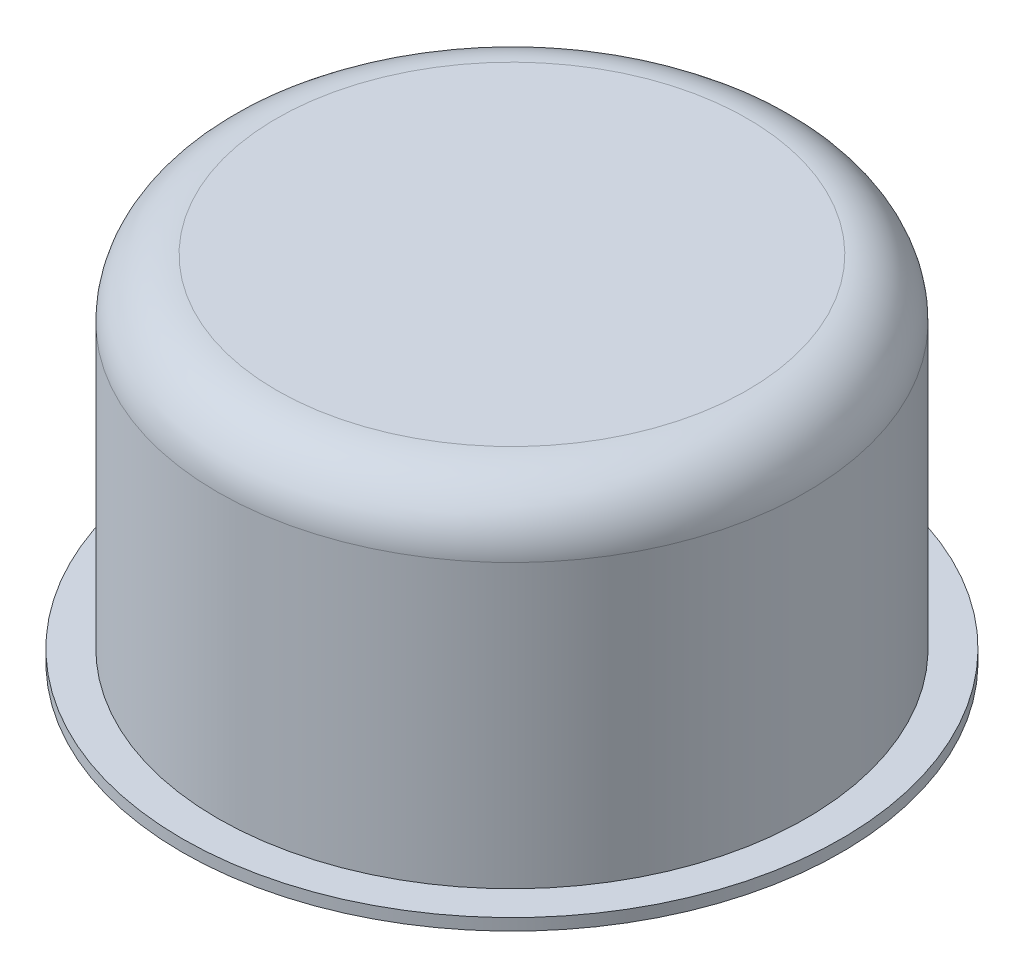
ISO-10303-21;
HEADER;
FILE_DESCRIPTION(('STEP AP214'),'2;1');
FILE_NAME('part.step','',(''),(''),'','','');
FILE_SCHEMA(('AUTOMOTIVE_DESIGN { 1 0 10303 214 1 1 1 1 }'));
ENDSEC;
DATA;
#1=APPLICATION_CONTEXT('core data for automotive mechanical design processes');
#2=APPLICATION_PROTOCOL_DEFINITION('international standard','automotive_design',2000,#1);
#3=PRODUCT_CONTEXT('',#1,'mechanical');
#4=PRODUCT('Part','Part','',(#3));
#5=PRODUCT_RELATED_PRODUCT_CATEGORY('part','',(#4));
#6=PRODUCT_DEFINITION_FORMATION('','',#4);
#7=PRODUCT_DEFINITION_CONTEXT('part definition',#1,'design');
#8=PRODUCT_DEFINITION('design','',#6,#7);
#9=PRODUCT_DEFINITION_SHAPE('','',#8);
#10=(LENGTH_UNIT() NAMED_UNIT(*) SI_UNIT(.MILLI.,.METRE.));
#11=(NAMED_UNIT(*) PLANE_ANGLE_UNIT() SI_UNIT($,.RADIAN.));
#12=(NAMED_UNIT(*) SI_UNIT($,.STERADIAN.) SOLID_ANGLE_UNIT());
#13=UNCERTAINTY_MEASURE_WITH_UNIT(LENGTH_MEASURE(1.E-05),#10,'distance_accuracy_value','');
#14=(GEOMETRIC_REPRESENTATION_CONTEXT(3) GLOBAL_UNCERTAINTY_ASSIGNED_CONTEXT((#13)) GLOBAL_UNIT_ASSIGNED_CONTEXT((#10,
#11,#12)) REPRESENTATION_CONTEXT('',''));
#15=CARTESIAN_POINT('',(0.,0.,0.));
#16=DIRECTION('',(0.,0.,1.));
#17=DIRECTION('',(1.,0.,0.));
#18=AXIS2_PLACEMENT_3D('',#15,#16,#17);
#19=CARTESIAN_POINT('',(0.,15.,0.));
#20=DIRECTION('',(0.,-1.,0.));
#21=DIRECTION('',(0.,0.,-1.));
#22=AXIS2_PLACEMENT_3D('',#19,#20,#21);
#23=CYLINDRICAL_SURFACE('',#22,12.5);
#24=CARTESIAN_POINT('',(0.,12.5,0.));
#25=DIRECTION('',(0.,1.,0.));
#26=DIRECTION('',(0.,0.,1.));
#27=AXIS2_PLACEMENT_3D('',#24,#25,#26);
#28=CIRCLE('',#27,12.5);
#29=CARTESIAN_POINT('',(0.,12.5,12.5));
#30=VERTEX_POINT('',#29);
#31=EDGE_CURVE('E42',#30,#30,#28,.F.);
#32=ORIENTED_EDGE('',*,*,#31,.T.);
#33=EDGE_LOOP('',(#32));
#34=FACE_BOUND('',#33,.T.);
#35=CARTESIAN_POINT('',(0.,0.5,0.));
#36=DIRECTION('',(0.,1.,0.));
#37=DIRECTION('',(0.,0.,1.));
#38=AXIS2_PLACEMENT_3D('',#35,#36,#37);
#39=CIRCLE('',#38,12.5);
#40=CARTESIAN_POINT('',(0.,0.5,12.5));
#41=VERTEX_POINT('',#40);
#42=EDGE_CURVE('E51',#41,#41,#39,.T.);
#43=ORIENTED_EDGE('',*,*,#42,.T.);
#44=EDGE_LOOP('',(#43));
#45=FACE_BOUND('',#44,.T.);
#46=ADVANCED_FACE('F31',(#34,#45),#23,.T.);
#47=CARTESIAN_POINT('',(0.,15.,0.));
#48=DIRECTION('',(0.,1.,0.));
#49=DIRECTION('',(0.,0.,1.));
#50=AXIS2_PLACEMENT_3D('',#47,#48,#49);
#51=PLANE('',#50);
#52=CARTESIAN_POINT('',(0.,15.,0.));
#53=DIRECTION('',(0.,1.,0.));
#54=DIRECTION('',(0.,0.,1.));
#55=AXIS2_PLACEMENT_3D('',#52,#53,#54);
#56=CIRCLE('',#55,10.);
#57=CARTESIAN_POINT('',(0.,15.,10.));
#58=VERTEX_POINT('',#57);
#59=EDGE_CURVE('E46',#58,#58,#56,.T.);
#60=ORIENTED_EDGE('',*,*,#59,.T.);
#61=EDGE_LOOP('',(#60));
#62=FACE_BOUND('',#61,.T.);
#63=ADVANCED_FACE('F81',(#62),#51,.T.);
#64=CARTESIAN_POINT('',(0.,0.5,0.));
#65=DIRECTION('',(0.,-1.,0.));
#66=DIRECTION('',(0.,0.,-1.));
#67=AXIS2_PLACEMENT_3D('',#64,#65,#66);
#68=CYLINDRICAL_SURFACE('',#67,14.);
#69=CARTESIAN_POINT('',(0.,0.5,0.));
#70=DIRECTION('',(0.,1.,0.));
#71=DIRECTION('',(0.,0.,1.));
#72=AXIS2_PLACEMENT_3D('',#69,#70,#71);
#73=CIRCLE('',#72,14.);
#74=CARTESIAN_POINT('',(0.,0.5,14.));
#75=VERTEX_POINT('',#74);
#76=EDGE_CURVE('E54',#75,#75,#73,.T.);
#77=ORIENTED_EDGE('',*,*,#76,.F.);
#78=EDGE_LOOP('',(#77));
#79=FACE_BOUND('',#78,.T.);
#80=CARTESIAN_POINT('',(0.,0.,0.));
#81=DIRECTION('',(0.,1.,0.));
#82=DIRECTION('',(0.,0.,1.));
#83=AXIS2_PLACEMENT_3D('',#80,#81,#82);
#84=CIRCLE('',#83,14.);
#85=CARTESIAN_POINT('',(0.,0.,14.));
#86=VERTEX_POINT('',#85);
#87=EDGE_CURVE('E55',#86,#86,#84,.T.);
#88=ORIENTED_EDGE('',*,*,#87,.T.);
#89=EDGE_LOOP('',(#88));
#90=FACE_BOUND('',#89,.T.);
#91=ADVANCED_FACE('F87',(#79,#90),#68,.T.);
#92=CARTESIAN_POINT('',(0.,0.5,0.));
#93=DIRECTION('',(0.,1.,0.));
#94=DIRECTION('',(0.,0.,1.));
#95=AXIS2_PLACEMENT_3D('',#92,#93,#94);
#96=PLANE('',#95);
#97=ORIENTED_EDGE('',*,*,#42,.F.);
#98=EDGE_LOOP('',(#97));
#99=FACE_BOUND('',#98,.T.);
#100=ORIENTED_EDGE('',*,*,#76,.T.);
#101=EDGE_LOOP('',(#100));
#102=FACE_BOUND('',#101,.T.);
#103=ADVANCED_FACE('F77',(#99,#102),#96,.T.);
#104=CARTESIAN_POINT('',(0.,0.,0.));
#105=DIRECTION('',(0.,1.,0.));
#106=DIRECTION('',(0.,0.,1.));
#107=AXIS2_PLACEMENT_3D('',#104,#105,#106);
#108=PLANE('',#107);
#109=CARTESIAN_POINT('',(0.,0.,0.));
#110=DIRECTION('',(0.,1.,0.));
#111=DIRECTION('',(0.,0.,1.));
#112=AXIS2_PLACEMENT_3D('',#109,#110,#111);
#113=CIRCLE('',#112,12.25);
#114=CARTESIAN_POINT('',(0.,0.,-12.25));
#115=VERTEX_POINT('',#114);
#116=EDGE_CURVE('E58',#115,#115,#113,.T.);
#117=ORIENTED_EDGE('',*,*,#116,.T.);
#118=EDGE_LOOP('',(#117));
#119=FACE_BOUND('',#118,.T.);
#120=ORIENTED_EDGE('',*,*,#87,.F.);
#121=EDGE_LOOP('',(#120));
#122=FACE_BOUND('',#121,.T.);
#123=ADVANCED_FACE('F64',(#119,#122),#108,.F.);
#124=CARTESIAN_POINT('',(0.,14.5,0.));
#125=DIRECTION('',(0.,-1.,0.));
#126=DIRECTION('',(0.,0.,-1.));
#127=AXIS2_PLACEMENT_3D('',#124,#125,#126);
#128=CYLINDRICAL_SURFACE('',#127,12.25);
#129=CARTESIAN_POINT('',(0.,12.,0.));
#130=DIRECTION('',(0.,1.,0.));
#131=DIRECTION('',(0.,0.,1.));
#132=AXIS2_PLACEMENT_3D('',#129,#130,#131);
#133=CIRCLE('',#132,12.25);
#134=CARTESIAN_POINT('',(0.,12.,-12.25));
#135=VERTEX_POINT('',#134);
#136=EDGE_CURVE('E38',#135,#135,#133,.T.);
#137=CARTESIAN_POINT('',(0.,12.,-12.25));
#138=CARTESIAN_POINT('',(0.,11.875,-12.25));
#139=CARTESIAN_POINT('',(0.,11.75,-12.25));
#140=CARTESIAN_POINT('',(0.,11.5,-12.25));
#141=CARTESIAN_POINT('',(0.,11.375,-12.25));
#142=CARTESIAN_POINT('',(0.,11.125,-12.25));
#143=CARTESIAN_POINT('',(0.,11.,-12.25));
#144=CARTESIAN_POINT('',(0.,10.75,-12.25));
#145=CARTESIAN_POINT('',(0.,10.625,-12.25));
#146=CARTESIAN_POINT('',(0.,10.375,-12.25));
#147=CARTESIAN_POINT('',(0.,10.25,-12.25));
#148=CARTESIAN_POINT('',(0.,10.,-12.25));
#149=CARTESIAN_POINT('',(0.,9.875,-12.25));
#150=CARTESIAN_POINT('',(0.,9.625,-12.25));
#151=CARTESIAN_POINT('',(0.,9.5,-12.25));
#152=CARTESIAN_POINT('',(0.,9.25,-12.25));
#153=CARTESIAN_POINT('',(0.,9.125,-12.25));
#154=CARTESIAN_POINT('',(0.,8.875,-12.25));
#155=CARTESIAN_POINT('',(0.,8.75,-12.25));
#156=CARTESIAN_POINT('',(0.,8.5,-12.25));
#157=CARTESIAN_POINT('',(0.,8.375,-12.25));
#158=CARTESIAN_POINT('',(0.,8.125,-12.25));
#159=CARTESIAN_POINT('',(0.,8.,-12.25));
#160=CARTESIAN_POINT('',(0.,7.75,-12.25));
#161=CARTESIAN_POINT('',(0.,7.625,-12.25));
#162=CARTESIAN_POINT('',(0.,7.375,-12.25));
#163=CARTESIAN_POINT('',(0.,7.25,-12.25));
#164=CARTESIAN_POINT('',(0.,7.,-12.25));
#165=CARTESIAN_POINT('',(0.,6.875,-12.25));
#166=CARTESIAN_POINT('',(0.,6.625,-12.25));
#167=CARTESIAN_POINT('',(0.,6.5,-12.25));
#168=CARTESIAN_POINT('',(0.,6.25,-12.25));
#169=CARTESIAN_POINT('',(0.,6.125,-12.25));
#170=CARTESIAN_POINT('',(0.,5.875,-12.25));
#171=CARTESIAN_POINT('',(0.,5.75,-12.25));
#172=CARTESIAN_POINT('',(0.,5.5,-12.25));
#173=CARTESIAN_POINT('',(0.,5.375,-12.25));
#174=CARTESIAN_POINT('',(0.,5.125,-12.25));
#175=CARTESIAN_POINT('',(0.,5.,-12.25));
#176=CARTESIAN_POINT('',(0.,4.75,-12.25));
#177=CARTESIAN_POINT('',(0.,4.625,-12.25));
#178=CARTESIAN_POINT('',(0.,4.375,-12.25));
#179=CARTESIAN_POINT('',(0.,4.25,-12.25));
#180=CARTESIAN_POINT('',(0.,4.,-12.25));
#181=CARTESIAN_POINT('',(0.,3.875,-12.25));
#182=CARTESIAN_POINT('',(0.,3.625,-12.25));
#183=CARTESIAN_POINT('',(0.,3.5,-12.25));
#184=CARTESIAN_POINT('',(0.,3.25,-12.25));
#185=CARTESIAN_POINT('',(0.,3.125,-12.25));
#186=CARTESIAN_POINT('',(0.,2.875,-12.25));
#187=CARTESIAN_POINT('',(0.,2.75,-12.25));
#188=CARTESIAN_POINT('',(0.,2.5,-12.25));
#189=CARTESIAN_POINT('',(0.,2.375,-12.25));
#190=CARTESIAN_POINT('',(0.,2.125,-12.25));
#191=CARTESIAN_POINT('',(0.,2.,-12.25));
#192=CARTESIAN_POINT('',(0.,1.75,-12.25));
#193=CARTESIAN_POINT('',(0.,1.625,-12.25));
#194=CARTESIAN_POINT('',(0.,1.375,-12.25));
#195=CARTESIAN_POINT('',(0.,1.25,-12.25));
#196=CARTESIAN_POINT('',(0.,1.,-12.25));
#197=CARTESIAN_POINT('',(0.,0.875,-12.25));
#198=CARTESIAN_POINT('',(0.,0.625000000000001,-12.25));
#199=CARTESIAN_POINT('',(0.,0.5,-12.25));
#200=CARTESIAN_POINT('',(0.,0.25,-12.25));
#201=CARTESIAN_POINT('',(0.,0.125,-12.25));
#202=CARTESIAN_POINT('',(0.,0.,-12.25));
#203=B_SPLINE_CURVE_WITH_KNOTS('',3,(#137,#138,#139,#140,#141,#142,#143,#144,#145,#146,#147,
#148,#149,#150,#151,#152,#153,#154,#155,#156,#157,#158,#159,#160,#161,#162,#163,#164,#165,#166,
#167,#168,#169,#170,#171,#172,#173,#174,#175,#176,#177,#178,#179,#180,#181,#182,#183,#184,#185,
#186,#187,#188,#189,#190,#191,#192,#193,#194,#195,#196,#197,#198,#199,#200,#201,#202),
.UNSPECIFIED.,.F.,.F.,(4,2,2,2,2,2,2,2,2,2,2,2,2,2,2,2,2,2,2,2,2,2,2,2,2,2,2,2,2,2,2,2,4),(0.,
0.374999999999999,0.749999999999999,1.125,1.5,1.875,2.25,2.625,3.,3.375,3.75,4.125,4.5,4.875,
5.25,5.625,6.,6.375,6.75,7.125,7.5,7.875,8.25,8.625,9.,9.375,9.75,10.125,10.5,10.875,11.25,
11.625,12.),.UNSPECIFIED.);
#204=EDGE_CURVE('BSEAM67',#135,#115,#203,.T.);
#205=ORIENTED_EDGE('',*,*,#136,.T.);
#206=ORIENTED_EDGE('',*,*,#116,.F.);
#207=ORIENTED_EDGE('',*,*,#204,.T.);
#208=ORIENTED_EDGE('',*,*,#204,.F.);
#209=EDGE_LOOP('',(#205,#207,#206,#208));
#210=FACE_BOUND('',#209,.T.);
#211=ADVANCED_FACE('F67',(#210),#128,.F.);
#212=CARTESIAN_POINT('',(0.,14.5,0.));
#213=DIRECTION('',(0.,1.,0.));
#214=DIRECTION('',(0.,0.,1.));
#215=AXIS2_PLACEMENT_3D('',#212,#213,#214);
#216=PLANE('',#215);
#217=CARTESIAN_POINT('',(0.,14.5,0.));
#218=DIRECTION('',(0.,1.,0.));
#219=DIRECTION('',(0.,0.,1.));
#220=AXIS2_PLACEMENT_3D('',#217,#218,#219);
#221=CIRCLE('',#220,9.75);
#222=CARTESIAN_POINT('',(0.,14.5,9.75));
#223=VERTEX_POINT('',#222);
#224=EDGE_CURVE('E10',#223,#223,#221,.F.);
#225=ORIENTED_EDGE('',*,*,#224,.T.);
#226=EDGE_LOOP('',(#225));
#227=FACE_BOUND('',#226,.T.);
#228=ADVANCED_FACE('F69',(#227),#216,.F.);
#229=CARTESIAN_POINT('',(0.,12.5,0.));
#230=DIRECTION('',(0.,1.,0.));
#231=DIRECTION('',(0.,0.,1.));
#232=AXIS2_PLACEMENT_3D('',#229,#230,#231);
#233=TOROIDAL_SURFACE('',#232,10.,2.5);
#234=ORIENTED_EDGE('',*,*,#31,.F.);
#235=EDGE_LOOP('',(#234));
#236=FACE_BOUND('',#235,.T.);
#237=ORIENTED_EDGE('',*,*,#59,.F.);
#238=EDGE_LOOP('',(#237));
#239=FACE_BOUND('',#238,.T.);
#240=ADVANCED_FACE('F75',(#236,#239),#233,.T.);
#241=CARTESIAN_POINT('',(0.,12.,0.));
#242=DIRECTION('',(0.,1.,0.));
#243=DIRECTION('',(0.,0.,1.));
#244=AXIS2_PLACEMENT_3D('',#241,#242,#243);
#245=TOROIDAL_SURFACE('',#244,9.75,2.5);
#246=ORIENTED_EDGE('',*,*,#224,.F.);
#247=EDGE_LOOP('',(#246));
#248=FACE_BOUND('',#247,.T.);
#249=ORIENTED_EDGE('',*,*,#136,.F.);
#250=EDGE_LOOP('',(#249));
#251=FACE_BOUND('',#250,.T.);
#252=ADVANCED_FACE('F33',(#248,#251),#245,.F.);
#253=CLOSED_SHELL('',(#46,#63,#91,#103,#123,#211,#228,#240,#252));
#254=MANIFOLD_SOLID_BREP('B2',#253);
#255=ADVANCED_BREP_SHAPE_REPRESENTATION('',(#18,#254),#14);
#256=SHAPE_DEFINITION_REPRESENTATION(#9,#255);
ENDSEC;
END-ISO-10303-21;
